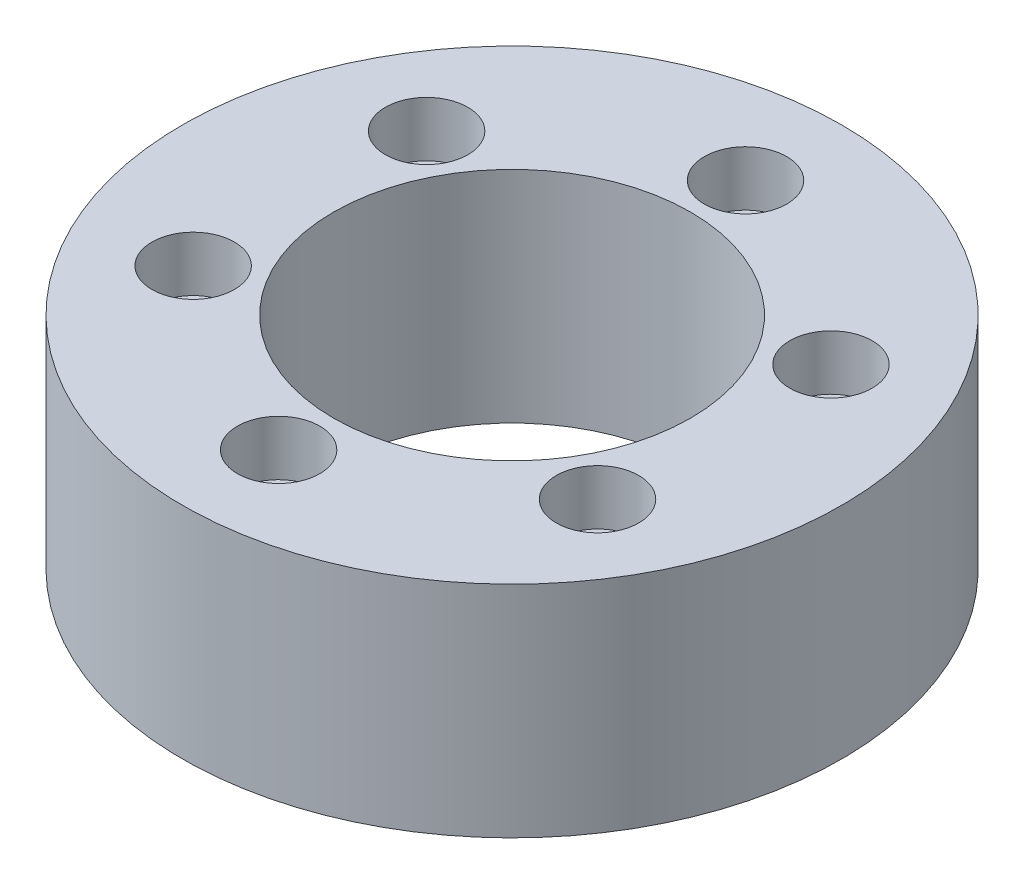
ISO-10303-21;
HEADER;
FILE_DESCRIPTION(('STEP AP214'),'2;1');
FILE_NAME('part.step','',(''),(''),'','','');
FILE_SCHEMA(('AUTOMOTIVE_DESIGN { 1 0 10303 214 1 1 1 1 }'));
ENDSEC;
DATA;
#1=APPLICATION_CONTEXT('core data for automotive mechanical design processes');
#2=APPLICATION_PROTOCOL_DEFINITION('international standard','automotive_design',2000,#1);
#3=PRODUCT_CONTEXT('',#1,'mechanical');
#4=PRODUCT('Part','Part','',(#3));
#5=PRODUCT_RELATED_PRODUCT_CATEGORY('part','',(#4));
#6=PRODUCT_DEFINITION_FORMATION('','',#4);
#7=PRODUCT_DEFINITION_CONTEXT('part definition',#1,'design');
#8=PRODUCT_DEFINITION('design','',#6,#7);
#9=PRODUCT_DEFINITION_SHAPE('','',#8);
#10=(LENGTH_UNIT() NAMED_UNIT(*) SI_UNIT(.MILLI.,.METRE.));
#11=(NAMED_UNIT(*) PLANE_ANGLE_UNIT() SI_UNIT($,.RADIAN.));
#12=(NAMED_UNIT(*) SI_UNIT($,.STERADIAN.) SOLID_ANGLE_UNIT());
#13=UNCERTAINTY_MEASURE_WITH_UNIT(LENGTH_MEASURE(1.E-05),#10,'distance_accuracy_value','');
#14=(GEOMETRIC_REPRESENTATION_CONTEXT(3) GLOBAL_UNCERTAINTY_ASSIGNED_CONTEXT((#13)) GLOBAL_UNIT_ASSIGNED_CONTEXT((#10,
#11,#12)) REPRESENTATION_CONTEXT('',''));
#15=CARTESIAN_POINT('',(0.,0.,0.));
#16=DIRECTION('',(0.,0.,1.));
#17=DIRECTION('',(1.,0.,0.));
#18=AXIS2_PLACEMENT_3D('',#15,#16,#17);
#19=CARTESIAN_POINT('',(-23.3718605846331,25.4,-13.4937500000009));
#20=DIRECTION('',(0.,1.,0.));
#21=DIRECTION('',(0.,0.,1.));
#22=AXIS2_PLACEMENT_3D('',#19,#20,#21);
#23=CYLINDRICAL_SURFACE('',#22,4.7625);
#24=CARTESIAN_POINT('',(-23.3718605846331,19.05,-13.4937500000009));
#25=DIRECTION('',(0.,1.,0.));
#26=DIRECTION('',(0.,0.,1.));
#27=AXIS2_PLACEMENT_3D('',#24,#25,#26);
#28=CIRCLE('',#27,4.7625);
#29=CARTESIAN_POINT('',(-23.3718605846331,19.05,-8.73125000000093));
#30=VERTEX_POINT('',#29);
#31=EDGE_CURVE('E99',#30,#30,#28,.T.);
#32=ORIENTED_EDGE('',*,*,#31,.F.);
#33=EDGE_LOOP('',(#32));
#34=FACE_BOUND('',#33,.T.);
#35=CARTESIAN_POINT('',(-23.3718605846331,25.4,-13.4937500000009));
#36=DIRECTION('',(0.,1.,0.));
#37=DIRECTION('',(0.,0.,1.));
#38=AXIS2_PLACEMENT_3D('',#35,#36,#37);
#39=CIRCLE('',#38,4.7625);
#40=CARTESIAN_POINT('',(-23.3718605846331,25.4,-8.73125000000093));
#41=VERTEX_POINT('',#40);
#42=EDGE_CURVE('E85',#41,#41,#39,.F.);
#43=ORIENTED_EDGE('',*,*,#42,.F.);
#44=EDGE_LOOP('',(#43));
#45=FACE_BOUND('',#44,.T.);
#46=ADVANCED_FACE('F14',(#34,#45),#23,.F.);
#47=CARTESIAN_POINT('',(5.24513843518981E-13,25.4,-26.987500000001));
#48=DIRECTION('',(0.,1.,0.));
#49=DIRECTION('',(0.,0.,1.));
#50=AXIS2_PLACEMENT_3D('',#47,#48,#49);
#51=CYLINDRICAL_SURFACE('',#50,4.7625);
#52=CARTESIAN_POINT('',(5.24513843518981E-13,19.05,-26.987500000001));
#53=DIRECTION('',(0.,1.,0.));
#54=DIRECTION('',(0.,0.,1.));
#55=AXIS2_PLACEMENT_3D('',#52,#53,#54);
#56=CIRCLE('',#55,4.7625);
#57=CARTESIAN_POINT('',(5.24513843518981E-13,19.05,-22.225000000001));
#58=VERTEX_POINT('',#57);
#59=EDGE_CURVE('E17',#58,#58,#56,.T.);
#60=ORIENTED_EDGE('',*,*,#59,.F.);
#61=EDGE_LOOP('',(#60));
#62=FACE_BOUND('',#61,.T.);
#63=CARTESIAN_POINT('',(5.24513843518981E-13,25.4,-26.987500000001));
#64=DIRECTION('',(0.,1.,0.));
#65=DIRECTION('',(0.,0.,1.));
#66=AXIS2_PLACEMENT_3D('',#63,#64,#65);
#67=CIRCLE('',#66,4.7625);
#68=CARTESIAN_POINT('',(5.24513843518981E-13,25.4,-22.225000000001));
#69=VERTEX_POINT('',#68);
#70=EDGE_CURVE('E82',#69,#69,#67,.F.);
#71=ORIENTED_EDGE('',*,*,#70,.F.);
#72=EDGE_LOOP('',(#71));
#73=FACE_BOUND('',#72,.T.);
#74=ADVANCED_FACE('F108',(#62,#73),#51,.F.);
#75=CARTESIAN_POINT('',(23.3718605846336,25.4,-13.49375));
#76=DIRECTION('',(0.,1.,0.));
#77=DIRECTION('',(0.,0.,1.));
#78=AXIS2_PLACEMENT_3D('',#75,#76,#77);
#79=CYLINDRICAL_SURFACE('',#78,4.7625);
#80=CARTESIAN_POINT('',(23.3718605846336,19.05,-13.49375));
#81=DIRECTION('',(0.,1.,0.));
#82=DIRECTION('',(0.,0.,1.));
#83=AXIS2_PLACEMENT_3D('',#80,#81,#82);
#84=CIRCLE('',#83,4.7625);
#85=CARTESIAN_POINT('',(23.3718605846336,19.05,-8.73125));
#86=VERTEX_POINT('',#85);
#87=EDGE_CURVE('E88',#86,#86,#84,.T.);
#88=ORIENTED_EDGE('',*,*,#87,.F.);
#89=EDGE_LOOP('',(#88));
#90=FACE_BOUND('',#89,.T.);
#91=CARTESIAN_POINT('',(23.3718605846336,25.4,-13.49375));
#92=DIRECTION('',(0.,1.,0.));
#93=DIRECTION('',(0.,0.,1.));
#94=AXIS2_PLACEMENT_3D('',#91,#92,#93);
#95=CIRCLE('',#94,4.7625);
#96=CARTESIAN_POINT('',(23.3718605846336,25.4,-8.73125));
#97=VERTEX_POINT('',#96);
#98=EDGE_CURVE('E79',#97,#97,#95,.F.);
#99=ORIENTED_EDGE('',*,*,#98,.F.);
#100=EDGE_LOOP('',(#99));
#101=FACE_BOUND('',#100,.T.);
#102=ADVANCED_FACE('F111',(#90,#101),#79,.F.);
#103=CARTESIAN_POINT('',(23.3718605846331,25.4,13.4937500000009));
#104=DIRECTION('',(0.,1.,0.));
#105=DIRECTION('',(0.,0.,1.));
#106=AXIS2_PLACEMENT_3D('',#103,#104,#105);
#107=CYLINDRICAL_SURFACE('',#106,4.7625);
#108=CARTESIAN_POINT('',(23.3718605846331,19.05,13.4937500000009));
#109=DIRECTION('',(0.,1.,0.));
#110=DIRECTION('',(0.,0.,1.));
#111=AXIS2_PLACEMENT_3D('',#108,#109,#110);
#112=CIRCLE('',#111,4.7625);
#113=CARTESIAN_POINT('',(23.3718605846331,19.05,18.2562500000009));
#114=VERTEX_POINT('',#113);
#115=EDGE_CURVE('E91',#114,#114,#112,.T.);
#116=ORIENTED_EDGE('',*,*,#115,.F.);
#117=EDGE_LOOP('',(#116));
#118=FACE_BOUND('',#117,.T.);
#119=CARTESIAN_POINT('',(23.3718605846331,25.4,13.4937500000009));
#120=DIRECTION('',(0.,1.,0.));
#121=DIRECTION('',(0.,0.,1.));
#122=AXIS2_PLACEMENT_3D('',#119,#120,#121);
#123=CIRCLE('',#122,4.7625);
#124=CARTESIAN_POINT('',(23.3718605846331,25.4,18.2562500000009));
#125=VERTEX_POINT('',#124);
#126=EDGE_CURVE('E76',#125,#125,#123,.F.);
#127=ORIENTED_EDGE('',*,*,#126,.F.);
#128=EDGE_LOOP('',(#127));
#129=FACE_BOUND('',#128,.T.);
#130=ADVANCED_FACE('F195',(#118,#129),#107,.F.);
#131=CARTESIAN_POINT('',(-5.14643649769776E-13,25.4,26.987500000001));
#132=DIRECTION('',(0.,1.,0.));
#133=DIRECTION('',(0.,0.,1.));
#134=AXIS2_PLACEMENT_3D('',#131,#132,#133);
#135=CYLINDRICAL_SURFACE('',#134,4.7625);
#136=CARTESIAN_POINT('',(-5.14643649769776E-13,19.05,26.987500000001));
#137=DIRECTION('',(0.,1.,0.));
#138=DIRECTION('',(0.,0.,1.));
#139=AXIS2_PLACEMENT_3D('',#136,#137,#138);
#140=CIRCLE('',#139,4.7625);
#141=CARTESIAN_POINT('',(-5.14643649769776E-13,19.05,31.750000000001));
#142=VERTEX_POINT('',#141);
#143=EDGE_CURVE('E94',#142,#142,#140,.T.);
#144=ORIENTED_EDGE('',*,*,#143,.F.);
#145=EDGE_LOOP('',(#144));
#146=FACE_BOUND('',#145,.T.);
#147=CARTESIAN_POINT('',(-5.14643649769776E-13,25.4,26.987500000001));
#148=DIRECTION('',(0.,1.,0.));
#149=DIRECTION('',(0.,0.,1.));
#150=AXIS2_PLACEMENT_3D('',#147,#148,#149);
#151=CIRCLE('',#150,4.7625);
#152=CARTESIAN_POINT('',(-5.14643649769776E-13,25.4,31.750000000001));
#153=VERTEX_POINT('',#152);
#154=EDGE_CURVE('E73',#153,#153,#151,.F.);
#155=ORIENTED_EDGE('',*,*,#154,.F.);
#156=EDGE_LOOP('',(#155));
#157=FACE_BOUND('',#156,.T.);
#158=ADVANCED_FACE('F191',(#146,#157),#135,.F.);
#159=CARTESIAN_POINT('',(-23.3718605846336,25.4,13.49375));
#160=DIRECTION('',(0.,1.,0.));
#161=DIRECTION('',(0.,0.,1.));
#162=AXIS2_PLACEMENT_3D('',#159,#160,#161);
#163=CYLINDRICAL_SURFACE('',#162,4.7625);
#164=CARTESIAN_POINT('',(-23.3718605846336,19.05,13.49375));
#165=DIRECTION('',(0.,1.,0.));
#166=DIRECTION('',(0.,0.,1.));
#167=AXIS2_PLACEMENT_3D('',#164,#165,#166);
#168=CIRCLE('',#167,4.7625);
#169=CARTESIAN_POINT('',(-23.3718605846336,19.05,18.25625));
#170=VERTEX_POINT('',#169);
#171=EDGE_CURVE('E97',#170,#170,#168,.T.);
#172=ORIENTED_EDGE('',*,*,#171,.F.);
#173=EDGE_LOOP('',(#172));
#174=FACE_BOUND('',#173,.T.);
#175=CARTESIAN_POINT('',(-23.3718605846336,25.4,13.49375));
#176=DIRECTION('',(0.,1.,0.));
#177=DIRECTION('',(0.,0.,1.));
#178=AXIS2_PLACEMENT_3D('',#175,#176,#177);
#179=CIRCLE('',#178,4.7625);
#180=CARTESIAN_POINT('',(-23.3718605846336,25.4,18.25625));
#181=VERTEX_POINT('',#180);
#182=EDGE_CURVE('E70',#181,#181,#179,.F.);
#183=ORIENTED_EDGE('',*,*,#182,.F.);
#184=EDGE_LOOP('',(#183));
#185=FACE_BOUND('',#184,.T.);
#186=ADVANCED_FACE('F184',(#174,#185),#163,.F.);
#187=CARTESIAN_POINT('',(0.,19.05,0.));
#188=DIRECTION('',(0.,1.,0.));
#189=DIRECTION('',(0.,0.,1.));
#190=AXIS2_PLACEMENT_3D('',#187,#188,#189);
#191=PLANE('',#190);
#192=CARTESIAN_POINT('',(0.,19.05,-26.9875));
#193=DIRECTION('',(0.,-1.,0.));
#194=DIRECTION('',(0.,0.,-1.));
#195=AXIS2_PLACEMENT_3D('',#192,#193,#194);
#196=CIRCLE('',#195,2.55269999999999);
#197=CARTESIAN_POINT('',(0.,19.05,-29.5402));
#198=VERTEX_POINT('',#197);
#199=EDGE_CURVE('E64',#198,#198,#196,.T.);
#200=ORIENTED_EDGE('',*,*,#199,.T.);
#201=EDGE_LOOP('',(#200));
#202=FACE_BOUND('',#201,.T.);
#203=ORIENTED_EDGE('',*,*,#59,.T.);
#204=EDGE_LOOP('',(#203));
#205=FACE_BOUND('',#204,.T.);
#206=ADVANCED_FACE('F106',(#202,#205),#191,.T.);
#207=CARTESIAN_POINT('',(0.,19.05,0.));
#208=DIRECTION('',(0.,1.,0.));
#209=DIRECTION('',(0.,0.,1.));
#210=AXIS2_PLACEMENT_3D('',#207,#208,#209);
#211=PLANE('',#210);
#212=CARTESIAN_POINT('',(-23.3718605846331,19.05,-13.4937500000009));
#213=DIRECTION('',(0.,-1.,0.));
#214=DIRECTION('',(0.,0.,-1.));
#215=AXIS2_PLACEMENT_3D('',#212,#213,#214);
#216=CIRCLE('',#215,2.55269999999999);
#217=CARTESIAN_POINT('',(-23.3718605846331,19.05,-16.0464500000009));
#218=VERTEX_POINT('',#217);
#219=EDGE_CURVE('E61',#218,#218,#216,.T.);
#220=ORIENTED_EDGE('',*,*,#219,.T.);
#221=EDGE_LOOP('',(#220));
#222=FACE_BOUND('',#221,.T.);
#223=ORIENTED_EDGE('',*,*,#31,.T.);
#224=EDGE_LOOP('',(#223));
#225=FACE_BOUND('',#224,.T.);
#226=ADVANCED_FACE('F173',(#222,#225),#211,.T.);
#227=CARTESIAN_POINT('',(0.,19.05,0.));
#228=DIRECTION('',(0.,1.,0.));
#229=DIRECTION('',(0.,0.,1.));
#230=AXIS2_PLACEMENT_3D('',#227,#228,#229);
#231=PLANE('',#230);
#232=CARTESIAN_POINT('',(-23.3718605846342,19.05,13.493749999999));
#233=DIRECTION('',(0.,-1.,0.));
#234=DIRECTION('',(0.,0.,-1.));
#235=AXIS2_PLACEMENT_3D('',#232,#233,#234);
#236=CIRCLE('',#235,2.55269999999999);
#237=CARTESIAN_POINT('',(-23.3718605846342,19.05,10.941049999999));
#238=VERTEX_POINT('',#237);
#239=EDGE_CURVE('E58',#238,#238,#236,.T.);
#240=ORIENTED_EDGE('',*,*,#239,.T.);
#241=EDGE_LOOP('',(#240));
#242=FACE_BOUND('',#241,.T.);
#243=ORIENTED_EDGE('',*,*,#171,.T.);
#244=EDGE_LOOP('',(#243));
#245=FACE_BOUND('',#244,.T.);
#246=ADVANCED_FACE('F175',(#242,#245),#231,.T.);
#247=CARTESIAN_POINT('',(0.,19.05,0.));
#248=DIRECTION('',(0.,1.,0.));
#249=DIRECTION('',(0.,0.,1.));
#250=AXIS2_PLACEMENT_3D('',#247,#248,#249);
#251=PLANE('',#250);
#252=CARTESIAN_POINT('',(-2.25411490948531E-12,19.05,26.9875));
#253=DIRECTION('',(0.,-1.,0.));
#254=DIRECTION('',(0.,0.,-1.));
#255=AXIS2_PLACEMENT_3D('',#252,#253,#254);
#256=CIRCLE('',#255,2.55269999999999);
#257=CARTESIAN_POINT('',(-2.25411490948531E-12,19.05,24.4348));
#258=VERTEX_POINT('',#257);
#259=EDGE_CURVE('E55',#258,#258,#256,.T.);
#260=ORIENTED_EDGE('',*,*,#259,.T.);
#261=EDGE_LOOP('',(#260));
#262=FACE_BOUND('',#261,.T.);
#263=ORIENTED_EDGE('',*,*,#143,.T.);
#264=EDGE_LOOP('',(#263));
#265=FACE_BOUND('',#264,.T.);
#266=ADVANCED_FACE('F181',(#262,#265),#251,.T.);
#267=CARTESIAN_POINT('',(0.,19.05,0.));
#268=DIRECTION('',(0.,1.,0.));
#269=DIRECTION('',(0.,0.,1.));
#270=AXIS2_PLACEMENT_3D('',#267,#268,#269);
#271=PLANE('',#270);
#272=CARTESIAN_POINT('',(23.3718605846308,19.05,13.4937500000009));
#273=DIRECTION('',(0.,-1.,0.));
#274=DIRECTION('',(0.,0.,-1.));
#275=AXIS2_PLACEMENT_3D('',#272,#273,#274);
#276=CIRCLE('',#275,2.55269999999999);
#277=CARTESIAN_POINT('',(23.3718605846308,19.05,10.941050000001));
#278=VERTEX_POINT('',#277);
#279=EDGE_CURVE('E52',#278,#278,#276,.T.);
#280=ORIENTED_EDGE('',*,*,#279,.T.);
#281=EDGE_LOOP('',(#280));
#282=FACE_BOUND('',#281,.T.);
#283=ORIENTED_EDGE('',*,*,#115,.T.);
#284=EDGE_LOOP('',(#283));
#285=FACE_BOUND('',#284,.T.);
#286=ADVANCED_FACE('F210',(#282,#285),#271,.T.);
#287=CARTESIAN_POINT('',(0.,19.05,0.));
#288=DIRECTION('',(0.,1.,0.));
#289=DIRECTION('',(0.,0.,1.));
#290=AXIS2_PLACEMENT_3D('',#287,#288,#289);
#291=PLANE('',#290);
#292=CARTESIAN_POINT('',(23.3718605846319,19.05,-13.493749999999));
#293=DIRECTION('',(0.,-1.,0.));
#294=DIRECTION('',(0.,0.,-1.));
#295=AXIS2_PLACEMENT_3D('',#292,#293,#294);
#296=CIRCLE('',#295,2.55269999999999);
#297=CARTESIAN_POINT('',(23.3718605846319,19.05,-16.046449999999));
#298=VERTEX_POINT('',#297);
#299=EDGE_CURVE('E49',#298,#298,#296,.T.);
#300=ORIENTED_EDGE('',*,*,#299,.T.);
#301=EDGE_LOOP('',(#300));
#302=FACE_BOUND('',#301,.T.);
#303=ORIENTED_EDGE('',*,*,#87,.T.);
#304=EDGE_LOOP('',(#303));
#305=FACE_BOUND('',#304,.T.);
#306=ADVANCED_FACE('F118',(#302,#305),#291,.T.);
#307=CARTESIAN_POINT('',(0.,25.4,0.));
#308=DIRECTION('',(0.,1.,0.));
#309=DIRECTION('',(0.,0.,1.));
#310=AXIS2_PLACEMENT_3D('',#307,#308,#309);
#311=PLANE('',#310);
#312=ORIENTED_EDGE('',*,*,#182,.T.);
#313=EDGE_LOOP('',(#312));
#314=FACE_BOUND('',#313,.T.);
#315=ORIENTED_EDGE('',*,*,#154,.T.);
#316=EDGE_LOOP('',(#315));
#317=FACE_BOUND('',#316,.T.);
#318=ORIENTED_EDGE('',*,*,#126,.T.);
#319=EDGE_LOOP('',(#318));
#320=FACE_BOUND('',#319,.T.);
#321=ORIENTED_EDGE('',*,*,#98,.T.);
#322=EDGE_LOOP('',(#321));
#323=FACE_BOUND('',#322,.T.);
#324=ORIENTED_EDGE('',*,*,#70,.T.);
#325=EDGE_LOOP('',(#324));
#326=FACE_BOUND('',#325,.T.);
#327=ORIENTED_EDGE('',*,*,#42,.T.);
#328=EDGE_LOOP('',(#327));
#329=FACE_BOUND('',#328,.T.);
#330=CARTESIAN_POINT('',(0.,25.4,0.));
#331=DIRECTION('',(0.,-1.,0.));
#332=DIRECTION('',(0.,0.,-1.));
#333=AXIS2_PLACEMENT_3D('',#330,#331,#332);
#334=CIRCLE('',#333,20.6375);
#335=CARTESIAN_POINT('',(0.,25.4,-20.6375));
#336=VERTEX_POINT('',#335);
#337=EDGE_CURVE('E46',#336,#336,#334,.T.);
#338=ORIENTED_EDGE('',*,*,#337,.T.);
#339=EDGE_LOOP('',(#338));
#340=FACE_BOUND('',#339,.T.);
#341=CARTESIAN_POINT('',(0.,25.4,0.));
#342=DIRECTION('',(0.,-1.,0.));
#343=DIRECTION('',(0.,0.,-1.));
#344=AXIS2_PLACEMENT_3D('',#341,#342,#343);
#345=CIRCLE('',#344,38.1);
#346=CARTESIAN_POINT('',(0.,25.4,-38.1));
#347=VERTEX_POINT('',#346);
#348=EDGE_CURVE('E67',#347,#347,#345,.T.);
#349=ORIENTED_EDGE('',*,*,#348,.F.);
#350=EDGE_LOOP('',(#349));
#351=FACE_BOUND('',#350,.T.);
#352=ADVANCED_FACE('F114',(#314,#317,#320,#323,#326,#329,#340,#351),#311,.T.);
#353=CARTESIAN_POINT('',(0.,25.4,0.));
#354=DIRECTION('',(0.,-1.,0.));
#355=DIRECTION('',(0.,0.,-1.));
#356=AXIS2_PLACEMENT_3D('',#353,#354,#355);
#357=CYLINDRICAL_SURFACE('',#356,38.1);
#358=CARTESIAN_POINT('',(0.,0.,0.));
#359=DIRECTION('',(0.,-1.,0.));
#360=DIRECTION('',(0.,0.,-1.));
#361=AXIS2_PLACEMENT_3D('',#358,#359,#360);
#362=CIRCLE('',#361,38.1);
#363=CARTESIAN_POINT('',(0.,0.,-38.1));
#364=VERTEX_POINT('',#363);
#365=EDGE_CURVE('E43',#364,#364,#362,.F.);
#366=ORIENTED_EDGE('',*,*,#365,.T.);
#367=EDGE_LOOP('',(#366));
#368=FACE_BOUND('',#367,.T.);
#369=ORIENTED_EDGE('',*,*,#348,.T.);
#370=EDGE_LOOP('',(#369));
#371=FACE_BOUND('',#370,.T.);
#372=ADVANCED_FACE('F117',(#368,#371),#357,.T.);
#373=CARTESIAN_POINT('',(0.,0.,-26.9875));
#374=DIRECTION('',(0.,-1.,0.));
#375=DIRECTION('',(0.,0.,-1.));
#376=AXIS2_PLACEMENT_3D('',#373,#374,#375);
#377=CYLINDRICAL_SURFACE('',#376,2.55269999999999);
#378=CARTESIAN_POINT('',(0.,0.,-26.9875));
#379=DIRECTION('',(0.,-1.,0.));
#380=DIRECTION('',(0.,0.,-1.));
#381=AXIS2_PLACEMENT_3D('',#378,#379,#380);
#382=CIRCLE('',#381,2.55269999999999);
#383=CARTESIAN_POINT('',(0.,0.,-29.5402));
#384=VERTEX_POINT('',#383);
#385=EDGE_CURVE('E40',#384,#384,#382,.T.);
#386=ORIENTED_EDGE('',*,*,#385,.T.);
#387=EDGE_LOOP('',(#386));
#388=FACE_BOUND('',#387,.T.);
#389=ORIENTED_EDGE('',*,*,#199,.F.);
#390=EDGE_LOOP('',(#389));
#391=FACE_BOUND('',#390,.T.);
#392=ADVANCED_FACE('F128',(#388,#391),#377,.F.);
#393=CARTESIAN_POINT('',(-23.3718605846331,0.,-13.4937500000009));
#394=DIRECTION('',(0.,-1.,0.));
#395=DIRECTION('',(0.,0.,-1.));
#396=AXIS2_PLACEMENT_3D('',#393,#394,#395);
#397=CYLINDRICAL_SURFACE('',#396,2.55269999999999);
#398=CARTESIAN_POINT('',(-23.3718605846331,0.,-13.4937500000009));
#399=DIRECTION('',(0.,-1.,0.));
#400=DIRECTION('',(0.,0.,-1.));
#401=AXIS2_PLACEMENT_3D('',#398,#399,#400);
#402=CIRCLE('',#401,2.55269999999999);
#403=CARTESIAN_POINT('',(-23.3718605846331,0.,-16.0464500000009));
#404=VERTEX_POINT('',#403);
#405=EDGE_CURVE('E37',#404,#404,#402,.T.);
#406=ORIENTED_EDGE('',*,*,#405,.T.);
#407=EDGE_LOOP('',(#406));
#408=FACE_BOUND('',#407,.T.);
#409=ORIENTED_EDGE('',*,*,#219,.F.);
#410=EDGE_LOOP('',(#409));
#411=FACE_BOUND('',#410,.T.);
#412=ADVANCED_FACE('F135',(#408,#411),#397,.F.);
#413=CARTESIAN_POINT('',(-23.3718605846342,0.,13.493749999999));
#414=DIRECTION('',(0.,-1.,0.));
#415=DIRECTION('',(0.,0.,-1.));
#416=AXIS2_PLACEMENT_3D('',#413,#414,#415);
#417=CYLINDRICAL_SURFACE('',#416,2.55269999999999);
#418=CARTESIAN_POINT('',(-23.3718605846342,0.,13.493749999999));
#419=DIRECTION('',(0.,-1.,0.));
#420=DIRECTION('',(0.,0.,-1.));
#421=AXIS2_PLACEMENT_3D('',#418,#419,#420);
#422=CIRCLE('',#421,2.55269999999999);
#423=CARTESIAN_POINT('',(-23.3718605846342,0.,10.941049999999));
#424=VERTEX_POINT('',#423);
#425=EDGE_CURVE('E34',#424,#424,#422,.T.);
#426=ORIENTED_EDGE('',*,*,#425,.T.);
#427=EDGE_LOOP('',(#426));
#428=FACE_BOUND('',#427,.T.);
#429=ORIENTED_EDGE('',*,*,#239,.F.);
#430=EDGE_LOOP('',(#429));
#431=FACE_BOUND('',#430,.T.);
#432=ADVANCED_FACE('F160',(#428,#431),#417,.F.);
#433=CARTESIAN_POINT('',(-2.25411490948531E-12,0.,26.9875));
#434=DIRECTION('',(0.,-1.,0.));
#435=DIRECTION('',(0.,0.,-1.));
#436=AXIS2_PLACEMENT_3D('',#433,#434,#435);
#437=CYLINDRICAL_SURFACE('',#436,2.55269999999999);
#438=CARTESIAN_POINT('',(-2.25411490948531E-12,0.,26.9875));
#439=DIRECTION('',(0.,-1.,0.));
#440=DIRECTION('',(0.,0.,-1.));
#441=AXIS2_PLACEMENT_3D('',#438,#439,#440);
#442=CIRCLE('',#441,2.55269999999999);
#443=CARTESIAN_POINT('',(-2.25411490948531E-12,0.,24.4348));
#444=VERTEX_POINT('',#443);
#445=EDGE_CURVE('E31',#444,#444,#442,.T.);
#446=ORIENTED_EDGE('',*,*,#445,.T.);
#447=EDGE_LOOP('',(#446));
#448=FACE_BOUND('',#447,.T.);
#449=ORIENTED_EDGE('',*,*,#259,.F.);
#450=EDGE_LOOP('',(#449));
#451=FACE_BOUND('',#450,.T.);
#452=ADVANCED_FACE('F156',(#448,#451),#437,.F.);
#453=CARTESIAN_POINT('',(23.3718605846308,0.,13.4937500000009));
#454=DIRECTION('',(0.,-1.,0.));
#455=DIRECTION('',(0.,0.,-1.));
#456=AXIS2_PLACEMENT_3D('',#453,#454,#455);
#457=CYLINDRICAL_SURFACE('',#456,2.55269999999999);
#458=CARTESIAN_POINT('',(23.3718605846308,0.,13.4937500000009));
#459=DIRECTION('',(0.,-1.,0.));
#460=DIRECTION('',(0.,0.,-1.));
#461=AXIS2_PLACEMENT_3D('',#458,#459,#460);
#462=CIRCLE('',#461,2.55269999999999);
#463=CARTESIAN_POINT('',(23.3718605846308,0.,10.941050000001));
#464=VERTEX_POINT('',#463);
#465=EDGE_CURVE('E26',#464,#464,#462,.T.);
#466=ORIENTED_EDGE('',*,*,#465,.T.);
#467=EDGE_LOOP('',(#466));
#468=FACE_BOUND('',#467,.T.);
#469=ORIENTED_EDGE('',*,*,#279,.F.);
#470=EDGE_LOOP('',(#469));
#471=FACE_BOUND('',#470,.T.);
#472=ADVANCED_FACE('F152',(#468,#471),#457,.F.);
#473=CARTESIAN_POINT('',(23.3718605846319,0.,-13.493749999999));
#474=DIRECTION('',(0.,-1.,0.));
#475=DIRECTION('',(0.,0.,-1.));
#476=AXIS2_PLACEMENT_3D('',#473,#474,#475);
#477=CYLINDRICAL_SURFACE('',#476,2.55269999999999);
#478=CARTESIAN_POINT('',(23.3718605846319,0.,-13.493749999999));
#479=DIRECTION('',(0.,-1.,0.));
#480=DIRECTION('',(0.,0.,-1.));
#481=AXIS2_PLACEMENT_3D('',#478,#479,#480);
#482=CIRCLE('',#481,2.55269999999999);
#483=CARTESIAN_POINT('',(23.3718605846319,0.,-16.046449999999));
#484=VERTEX_POINT('',#483);
#485=EDGE_CURVE('E21',#484,#484,#482,.T.);
#486=ORIENTED_EDGE('',*,*,#485,.T.);
#487=EDGE_LOOP('',(#486));
#488=FACE_BOUND('',#487,.T.);
#489=ORIENTED_EDGE('',*,*,#299,.F.);
#490=EDGE_LOOP('',(#489));
#491=FACE_BOUND('',#490,.T.);
#492=ADVANCED_FACE('F146',(#488,#491),#477,.F.);
#493=CARTESIAN_POINT('',(0.,25.4,0.));
#494=DIRECTION('',(0.,-1.,0.));
#495=DIRECTION('',(0.,0.,-1.));
#496=AXIS2_PLACEMENT_3D('',#493,#494,#495);
#497=CYLINDRICAL_SURFACE('',#496,20.6375);
#498=CARTESIAN_POINT('',(0.,0.,0.));
#499=DIRECTION('',(0.,-1.,0.));
#500=DIRECTION('',(0.,0.,-1.));
#501=AXIS2_PLACEMENT_3D('',#498,#499,#500);
#502=CIRCLE('',#501,20.6375);
#503=CARTESIAN_POINT('',(0.,0.,-20.6375));
#504=VERTEX_POINT('',#503);
#505=EDGE_CURVE('E10',#504,#504,#502,.T.);
#506=ORIENTED_EDGE('',*,*,#505,.T.);
#507=EDGE_LOOP('',(#506));
#508=FACE_BOUND('',#507,.T.);
#509=ORIENTED_EDGE('',*,*,#337,.F.);
#510=EDGE_LOOP('',(#509));
#511=FACE_BOUND('',#510,.T.);
#512=ADVANCED_FACE('F140',(#508,#511),#497,.F.);
#513=CARTESIAN_POINT('',(0.,0.,0.));
#514=DIRECTION('',(0.,1.,0.));
#515=DIRECTION('',(0.,0.,1.));
#516=AXIS2_PLACEMENT_3D('',#513,#514,#515);
#517=PLANE('',#516);
#518=ORIENTED_EDGE('',*,*,#505,.F.);
#519=EDGE_LOOP('',(#518));
#520=FACE_BOUND('',#519,.T.);
#521=ORIENTED_EDGE('',*,*,#485,.F.);
#522=EDGE_LOOP('',(#521));
#523=FACE_BOUND('',#522,.T.);
#524=ORIENTED_EDGE('',*,*,#465,.F.);
#525=EDGE_LOOP('',(#524));
#526=FACE_BOUND('',#525,.T.);
#527=ORIENTED_EDGE('',*,*,#445,.F.);
#528=EDGE_LOOP('',(#527));
#529=FACE_BOUND('',#528,.T.);
#530=ORIENTED_EDGE('',*,*,#425,.F.);
#531=EDGE_LOOP('',(#530));
#532=FACE_BOUND('',#531,.T.);
#533=ORIENTED_EDGE('',*,*,#405,.F.);
#534=EDGE_LOOP('',(#533));
#535=FACE_BOUND('',#534,.T.);
#536=ORIENTED_EDGE('',*,*,#385,.F.);
#537=EDGE_LOOP('',(#536));
#538=FACE_BOUND('',#537,.T.);
#539=ORIENTED_EDGE('',*,*,#365,.F.);
#540=EDGE_LOOP('',(#539));
#541=FACE_BOUND('',#540,.T.);
#542=ADVANCED_FACE('F138',(#520,#523,#526,#529,#532,#535,#538,#541),#517,.F.);
#543=CLOSED_SHELL('',(#46,#74,#102,#130,#158,#186,#206,#226,#246,#266,#286,#306,#352,#372,#392,
#412,#432,#452,#472,#492,#512,#542));
#544=MANIFOLD_SOLID_BREP('B1',#543);
#545=ADVANCED_BREP_SHAPE_REPRESENTATION('',(#18,#544),#14);
#546=SHAPE_DEFINITION_REPRESENTATION(#9,#545);
ENDSEC;
END-ISO-10303-21;
